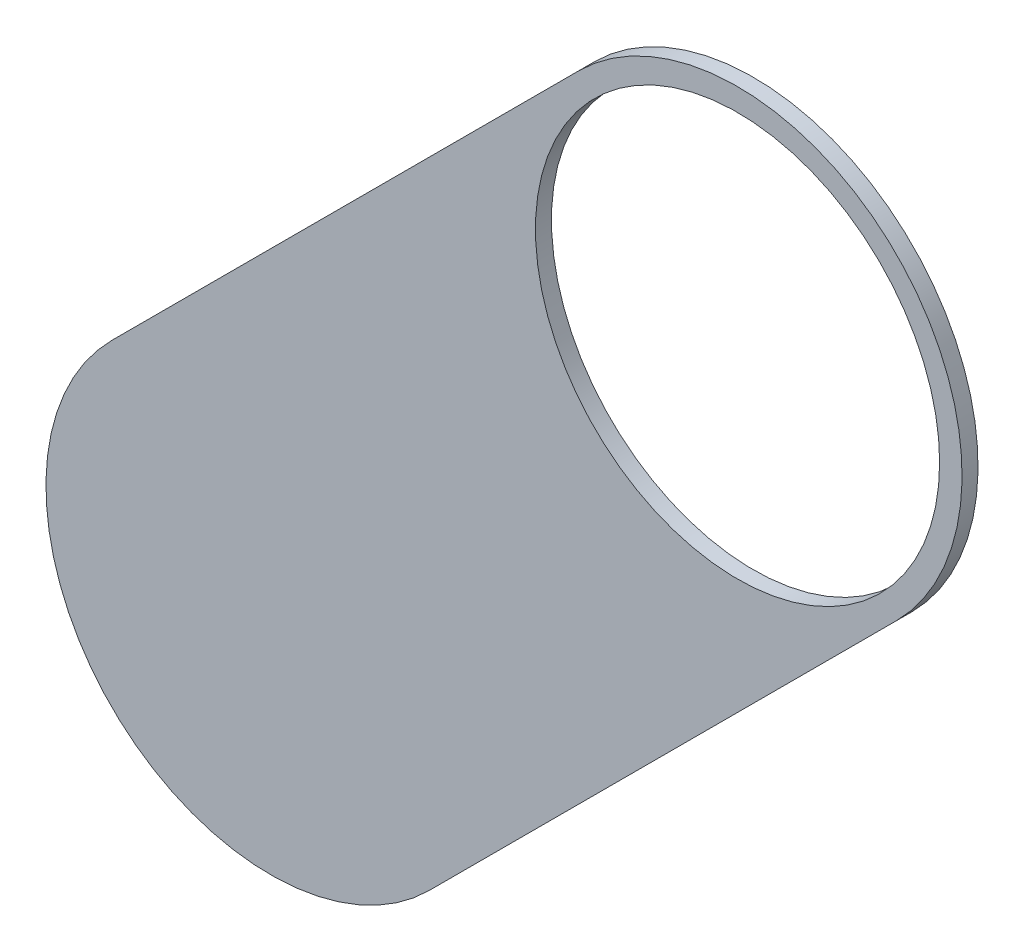
ISO-10303-21;
HEADER;
FILE_DESCRIPTION(('STEP AP214'),'2;1');
FILE_NAME('part.step','',(''),(''),'','','');
FILE_SCHEMA(('AUTOMOTIVE_DESIGN { 1 0 10303 214 1 1 1 1 }'));
ENDSEC;
DATA;
#1=APPLICATION_CONTEXT('core data for automotive mechanical design processes');
#2=APPLICATION_PROTOCOL_DEFINITION('international standard','automotive_design',2000,#1);
#3=PRODUCT_CONTEXT('',#1,'mechanical');
#4=PRODUCT('Part','Part','',(#3));
#5=PRODUCT_RELATED_PRODUCT_CATEGORY('part','',(#4));
#6=PRODUCT_DEFINITION_FORMATION('','',#4);
#7=PRODUCT_DEFINITION_CONTEXT('part definition',#1,'design');
#8=PRODUCT_DEFINITION('design','',#6,#7);
#9=PRODUCT_DEFINITION_SHAPE('','',#8);
#10=(LENGTH_UNIT() NAMED_UNIT(*) SI_UNIT(.MILLI.,.METRE.));
#11=(NAMED_UNIT(*) PLANE_ANGLE_UNIT() SI_UNIT($,.RADIAN.));
#12=(NAMED_UNIT(*) SI_UNIT($,.STERADIAN.) SOLID_ANGLE_UNIT());
#13=UNCERTAINTY_MEASURE_WITH_UNIT(LENGTH_MEASURE(1.E-05),#10,'distance_accuracy_value','');
#14=(GEOMETRIC_REPRESENTATION_CONTEXT(3) GLOBAL_UNCERTAINTY_ASSIGNED_CONTEXT((#13)) GLOBAL_UNIT_ASSIGNED_CONTEXT((#10,
#11,#12)) REPRESENTATION_CONTEXT('',''));
#15=CARTESIAN_POINT('',(0.,0.,0.));
#16=DIRECTION('',(0.,0.,1.));
#17=DIRECTION('',(1.,0.,0.));
#18=AXIS2_PLACEMENT_3D('',#15,#16,#17);
#19=CARTESIAN_POINT('',(87.21352636,42.14643844,0.));
#20=DIRECTION('',(-0.707106781186543,0.707106781186552,0.));
#21=DIRECTION('',(0.707106781186552,0.707106781186543,0.));
#22=AXIS2_PLACEMENT_3D('',#19,#20,#21);
#23=PLANE('',#22);
#24=DIRECTION('',(0.707106781186552,0.707106781186543,0.));
#25=VECTOR('',#24,1.);
#26=CARTESIAN_POINT('',(87.21352636,42.14643844,0.03556));
#27=LINE('',#26,#25);
#28=CARTESIAN_POINT('',(87.21352636,42.14643844,0.03556));
#29=VERTEX_POINT('',#28);
#30=CARTESIAN_POINT('',(88.25355476,43.18646684,0.03556));
#31=VERTEX_POINT('',#30);
#32=EDGE_CURVE('E11',#29,#31,#27,.T.);
#33=ORIENTED_EDGE('',*,*,#32,.F.);
#34=DIRECTION('',(0.,0.,1.));
#35=VECTOR('',#34,1.);
#36=CARTESIAN_POINT('',(87.21352636,42.14643844,0.));
#37=LINE('',#36,#35);
#38=CARTESIAN_POINT('',(87.21352636,42.14643844,0.));
#39=VERTEX_POINT('',#38);
#40=EDGE_CURVE('E24',#39,#29,#37,.T.);
#41=ORIENTED_EDGE('',*,*,#40,.F.);
#42=DIRECTION('',(0.707106781186552,0.707106781186543,0.));
#43=VECTOR('',#42,1.);
#44=CARTESIAN_POINT('',(87.21352636,42.14643844,0.));
#45=LINE('',#44,#43);
#46=CARTESIAN_POINT('',(88.25355476,43.18646684,0.));
#47=VERTEX_POINT('',#46);
#48=EDGE_CURVE('E96',#39,#47,#45,.T.);
#49=ORIENTED_EDGE('',*,*,#48,.T.);
#50=DIRECTION('',(0.,0.,1.));
#51=VECTOR('',#50,1.);
#52=CARTESIAN_POINT('',(88.25355476,43.18646684,0.));
#53=LINE('',#52,#51);
#54=EDGE_CURVE('E37',#47,#31,#53,.T.);
#55=ORIENTED_EDGE('',*,*,#54,.T.);
#56=EDGE_LOOP('',(#33,#41,#49,#55));
#57=FACE_BOUND('',#56,.T.);
#58=ADVANCED_FACE('F17',(#57),#23,.F.);
#59=CARTESIAN_POINT('',(86.8599736,42.4999912,0.));
#60=DIRECTION('',(0.,0.,-1.));
#61=DIRECTION('',(-0.707106781186533,0.707106781186562,0.));
#62=AXIS2_PLACEMENT_3D('',#59,#60,#61);
#63=CYLINDRICAL_SURFACE('',#62,0.499999108206433);
#64=CARTESIAN_POINT('',(86.8599736,42.4999912,0.03556));
#65=DIRECTION('',(0.,0.,1.));
#66=DIRECTION('',(-0.707106781186533,0.707106781186562,0.));
#67=AXIS2_PLACEMENT_3D('',#64,#65,#66);
#68=CIRCLE('',#67,0.499999108206433);
#69=CARTESIAN_POINT('',(86.50642084,42.85354396,0.03556));
#70=VERTEX_POINT('',#69);
#71=EDGE_CURVE('E92',#70,#29,#68,.T.);
#72=ORIENTED_EDGE('',*,*,#71,.F.);
#73=DIRECTION('',(0.,0.,1.));
#74=VECTOR('',#73,1.);
#75=CARTESIAN_POINT('',(86.50642084,42.85354396,0.));
#76=LINE('',#75,#74);
#77=CARTESIAN_POINT('',(86.50642084,42.85354396,0.));
#78=VERTEX_POINT('',#77);
#79=EDGE_CURVE('E90',#78,#70,#76,.T.);
#80=ORIENTED_EDGE('',*,*,#79,.F.);
#81=CARTESIAN_POINT('',(86.8599736,42.4999912,0.));
#82=DIRECTION('',(0.,0.,1.));
#83=DIRECTION('',(-0.707106781186533,0.707106781186562,0.));
#84=AXIS2_PLACEMENT_3D('',#81,#82,#83);
#85=CIRCLE('',#84,0.499999108206433);
#86=EDGE_CURVE('E88',#78,#39,#85,.T.);
#87=ORIENTED_EDGE('',*,*,#86,.T.);
#88=ORIENTED_EDGE('',*,*,#40,.T.);
#89=EDGE_LOOP('',(#72,#80,#87,#88));
#90=FACE_BOUND('',#89,.T.);
#91=ADVANCED_FACE('F111',(#90),#63,.T.);
#92=CARTESIAN_POINT('',(87.900002,43.5400196,0.));
#93=DIRECTION('',(0.,0.,-1.));
#94=DIRECTION('',(0.707106781186548,-0.707106781186548,0.));
#95=AXIS2_PLACEMENT_3D('',#92,#93,#94);
#96=CYLINDRICAL_SURFACE('',#95,0.499999108206442);
#97=CARTESIAN_POINT('',(87.900002,43.5400196,0.03556));
#98=DIRECTION('',(0.,0.,1.));
#99=DIRECTION('',(0.707106781186548,-0.707106781186548,0.));
#100=AXIS2_PLACEMENT_3D('',#97,#98,#99);
#101=CIRCLE('',#100,0.499999108206442);
#102=CARTESIAN_POINT('',(87.54644924,43.89357236,0.03556));
#103=VERTEX_POINT('',#102);
#104=EDGE_CURVE('E85',#31,#103,#101,.T.);
#105=ORIENTED_EDGE('',*,*,#104,.F.);
#106=ORIENTED_EDGE('',*,*,#54,.F.);
#107=CARTESIAN_POINT('',(87.900002,43.5400196,0.));
#108=DIRECTION('',(0.,0.,1.));
#109=DIRECTION('',(0.707106781186548,-0.707106781186548,0.));
#110=AXIS2_PLACEMENT_3D('',#107,#108,#109);
#111=CIRCLE('',#110,0.499999108206442);
#112=CARTESIAN_POINT('',(87.54644924,43.89357236,0.));
#113=VERTEX_POINT('',#112);
#114=EDGE_CURVE('E82',#47,#113,#111,.T.);
#115=ORIENTED_EDGE('',*,*,#114,.T.);
#116=DIRECTION('',(0.,0.,1.));
#117=VECTOR('',#116,1.);
#118=CARTESIAN_POINT('',(87.54644924,43.89357236,0.));
#119=LINE('',#118,#117);
#120=EDGE_CURVE('E80',#113,#103,#119,.T.);
#121=ORIENTED_EDGE('',*,*,#120,.T.);
#122=EDGE_LOOP('',(#105,#106,#115,#121));
#123=FACE_BOUND('',#122,.T.);
#124=ADVANCED_FACE('F104',(#123),#96,.T.);
#125=CARTESIAN_POINT('',(87.54644924,43.89357236,0.));
#126=DIRECTION('',(0.70710678118655,-0.707106781186545,0.));
#127=DIRECTION('',(-0.707106781186545,-0.70710678118655,0.));
#128=AXIS2_PLACEMENT_3D('',#125,#126,#127);
#129=PLANE('',#128);
#130=DIRECTION('',(-0.707106781186545,-0.70710678118655,0.));
#131=VECTOR('',#130,1.);
#132=CARTESIAN_POINT('',(87.54644924,43.89357236,0.03556));
#133=LINE('',#132,#131);
#134=EDGE_CURVE('E77',#103,#70,#133,.T.);
#135=ORIENTED_EDGE('',*,*,#134,.F.);
#136=ORIENTED_EDGE('',*,*,#120,.F.);
#137=DIRECTION('',(-0.707106781186545,-0.70710678118655,0.));
#138=VECTOR('',#137,1.);
#139=CARTESIAN_POINT('',(87.54644924,43.89357236,0.));
#140=LINE('',#139,#138);
#141=EDGE_CURVE('E68',#113,#78,#140,.T.);
#142=ORIENTED_EDGE('',*,*,#141,.T.);
#143=ORIENTED_EDGE('',*,*,#79,.T.);
#144=EDGE_LOOP('',(#135,#136,#142,#143));
#145=FACE_BOUND('',#144,.T.);
#146=ADVANCED_FACE('F110',(#145),#129,.F.);
#147=CARTESIAN_POINT('',(87.900002,43.5400196,0.));
#148=DIRECTION('',(0.,0.,-1.));
#149=DIRECTION('',(1.,0.,0.));
#150=AXIS2_PLACEMENT_3D('',#147,#148,#149);
#151=CYLINDRICAL_SURFACE('',#150,0.4499991);
#152=DIRECTION('',(0.,0.,1.));
#153=VECTOR('',#152,1.);
#154=CARTESIAN_POINT('',(88.3500011,43.5400196,0.));
#155=LINE('',#154,#153);
#156=CARTESIAN_POINT('',(88.3500011,43.5400196,0.));
#157=VERTEX_POINT('',#156);
#158=CARTESIAN_POINT('',(88.3500011,43.5400196,0.03556));
#159=VERTEX_POINT('',#158);
#160=EDGE_CURVE('E62',#157,#159,#155,.T.);
#161=ORIENTED_EDGE('',*,*,#160,.T.);
#162=CARTESIAN_POINT('',(87.900002,43.5400196,0.03556));
#163=DIRECTION('',(0.,0.,1.));
#164=DIRECTION('',(1.,0.,0.));
#165=AXIS2_PLACEMENT_3D('',#162,#163,#164);
#166=CIRCLE('',#165,0.4499991);
#167=EDGE_CURVE('E67',#159,#159,#166,.T.);
#168=ORIENTED_EDGE('',*,*,#167,.T.);
#169=ORIENTED_EDGE('',*,*,#160,.F.);
#170=CARTESIAN_POINT('',(87.900002,43.5400196,0.));
#171=DIRECTION('',(0.,0.,1.));
#172=DIRECTION('',(1.,0.,0.));
#173=AXIS2_PLACEMENT_3D('',#170,#171,#172);
#174=CIRCLE('',#173,0.4499991);
#175=EDGE_CURVE('E65',#157,#157,#174,.T.);
#176=ORIENTED_EDGE('',*,*,#175,.F.);
#177=EDGE_LOOP('',(#161,#168,#169,#176));
#178=FACE_BOUND('',#177,.T.);
#179=ADVANCED_FACE('F64',(#178),#151,.F.);
#180=CARTESIAN_POINT('',(87.21352636,42.14643844,0.));
#181=DIRECTION('',(0.,0.,-1.));
#182=DIRECTION('',(-1.,0.,0.));
#183=AXIS2_PLACEMENT_3D('',#180,#181,#182);
#184=PLANE('',#183);
#185=ORIENTED_EDGE('',*,*,#48,.F.);
#186=ORIENTED_EDGE('',*,*,#86,.F.);
#187=ORIENTED_EDGE('',*,*,#141,.F.);
#188=ORIENTED_EDGE('',*,*,#114,.F.);
#189=EDGE_LOOP('',(#185,#186,#187,#188));
#190=FACE_BOUND('',#189,.T.);
#191=ORIENTED_EDGE('',*,*,#175,.T.);
#192=EDGE_LOOP('',(#191));
#193=FACE_BOUND('',#192,.T.);
#194=ADVANCED_FACE('F71',(#190,#193),#184,.T.);
#195=CARTESIAN_POINT('',(87.21352636,42.14643844,0.03556));
#196=DIRECTION('',(0.,0.,-1.));
#197=DIRECTION('',(-1.,0.,0.));
#198=AXIS2_PLACEMENT_3D('',#195,#196,#197);
#199=PLANE('',#198);
#200=ORIENTED_EDGE('',*,*,#134,.T.);
#201=ORIENTED_EDGE('',*,*,#71,.T.);
#202=ORIENTED_EDGE('',*,*,#32,.T.);
#203=ORIENTED_EDGE('',*,*,#104,.T.);
#204=EDGE_LOOP('',(#200,#201,#202,#203));
#205=FACE_BOUND('',#204,.T.);
#206=ORIENTED_EDGE('',*,*,#167,.F.);
#207=EDGE_LOOP('',(#206));
#208=FACE_BOUND('',#207,.T.);
#209=ADVANCED_FACE('F107',(#205,#208),#199,.F.);
#210=CLOSED_SHELL('',(#58,#91,#124,#146,#179,#194,#209));
#211=MANIFOLD_SOLID_BREP('B1',#210);
#212=ADVANCED_BREP_SHAPE_REPRESENTATION('',(#18,#211),#14);
#213=SHAPE_DEFINITION_REPRESENTATION(#9,#212);
ENDSEC;
END-ISO-10303-21;
